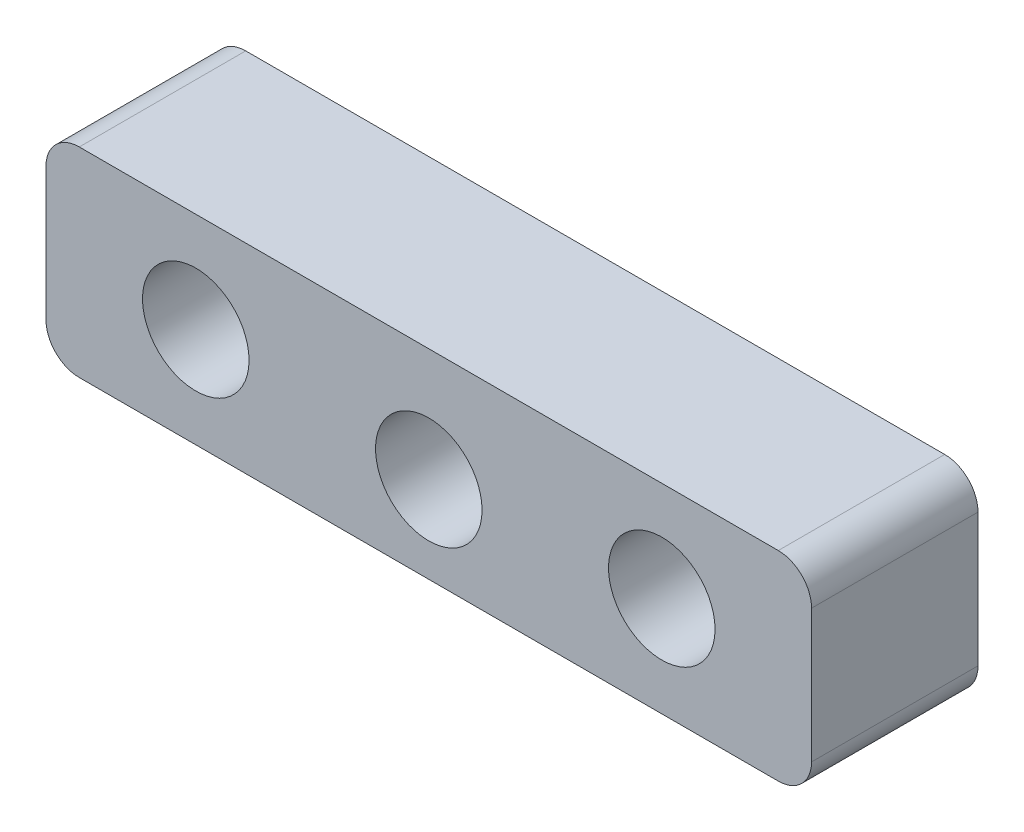
ISO-10303-21;
HEADER;
FILE_DESCRIPTION(('STEP AP214'),'2;1');
FILE_NAME('part.step','',(''),(''),'','','');
FILE_SCHEMA(('AUTOMOTIVE_DESIGN { 1 0 10303 214 1 1 1 1 }'));
ENDSEC;
DATA;
#1=APPLICATION_CONTEXT('core data for automotive mechanical design processes');
#2=APPLICATION_PROTOCOL_DEFINITION('international standard','automotive_design',2000,#1);
#3=PRODUCT_CONTEXT('',#1,'mechanical');
#4=PRODUCT('Part','Part','',(#3));
#5=PRODUCT_RELATED_PRODUCT_CATEGORY('part','',(#4));
#6=PRODUCT_DEFINITION_FORMATION('','',#4);
#7=PRODUCT_DEFINITION_CONTEXT('part definition',#1,'design');
#8=PRODUCT_DEFINITION('design','',#6,#7);
#9=PRODUCT_DEFINITION_SHAPE('','',#8);
#10=(LENGTH_UNIT() NAMED_UNIT(*) SI_UNIT(.MILLI.,.METRE.));
#11=(NAMED_UNIT(*) PLANE_ANGLE_UNIT() SI_UNIT($,.RADIAN.));
#12=(NAMED_UNIT(*) SI_UNIT($,.STERADIAN.) SOLID_ANGLE_UNIT());
#13=UNCERTAINTY_MEASURE_WITH_UNIT(LENGTH_MEASURE(1.E-05),#10,'distance_accuracy_value','');
#14=(GEOMETRIC_REPRESENTATION_CONTEXT(3) GLOBAL_UNCERTAINTY_ASSIGNED_CONTEXT((#13)) GLOBAL_UNIT_ASSIGNED_CONTEXT((#10,
#11,#12)) REPRESENTATION_CONTEXT('',''));
#15=CARTESIAN_POINT('',(0.,0.,0.));
#16=DIRECTION('',(0.,0.,1.));
#17=DIRECTION('',(1.,0.,0.));
#18=AXIS2_PLACEMENT_3D('',#15,#16,#17);
#19=CARTESIAN_POINT('',(11.5,3.,5.));
#20=DIRECTION('',(-1.,0.,0.));
#21=DIRECTION('',(0.,0.,1.));
#22=AXIS2_PLACEMENT_3D('',#19,#20,#21);
#23=PLANE('',#22);
#24=DIRECTION('',(0.,1.,0.));
#25=VECTOR('',#24,1.);
#26=CARTESIAN_POINT('',(11.5,3.,5.));
#27=LINE('',#26,#25);
#28=CARTESIAN_POINT('',(11.5,-2.,5.));
#29=VERTEX_POINT('',#28);
#30=CARTESIAN_POINT('',(11.5,2.,5.));
#31=VERTEX_POINT('',#30);
#32=EDGE_CURVE('E132',#29,#31,#27,.T.);
#33=ORIENTED_EDGE('',*,*,#32,.F.);
#34=DIRECTION('',(0.,0.,-1.));
#35=VECTOR('',#34,1.);
#36=CARTESIAN_POINT('',(11.5,-2.,5.));
#37=LINE('',#36,#35);
#38=CARTESIAN_POINT('',(11.5,-2.,0.));
#39=VERTEX_POINT('',#38);
#40=EDGE_CURVE('E116',#29,#39,#37,.T.);
#41=ORIENTED_EDGE('',*,*,#40,.T.);
#42=DIRECTION('',(0.,1.,0.));
#43=VECTOR('',#42,1.);
#44=CARTESIAN_POINT('',(11.5,3.,0.));
#45=LINE('',#44,#43);
#46=CARTESIAN_POINT('',(11.5,2.,0.));
#47=VERTEX_POINT('',#46);
#48=EDGE_CURVE('E129',#39,#47,#45,.T.);
#49=ORIENTED_EDGE('',*,*,#48,.T.);
#50=DIRECTION('',(0.,0.,-1.));
#51=VECTOR('',#50,1.);
#52=CARTESIAN_POINT('',(11.5,2.,5.));
#53=LINE('',#52,#51);
#54=EDGE_CURVE('E135',#47,#31,#53,.F.);
#55=ORIENTED_EDGE('',*,*,#54,.T.);
#56=EDGE_LOOP('',(#33,#41,#49,#55));
#57=FACE_BOUND('',#56,.T.);
#58=ADVANCED_FACE('F45',(#57),#23,.F.);
#59=CARTESIAN_POINT('',(-11.5,3.,5.));
#60=DIRECTION('',(0.,-1.,0.));
#61=DIRECTION('',(0.,0.,-1.));
#62=AXIS2_PLACEMENT_3D('',#59,#60,#61);
#63=PLANE('',#62);
#64=DIRECTION('',(-1.,0.,0.));
#65=VECTOR('',#64,1.);
#66=CARTESIAN_POINT('',(-11.5,3.,5.));
#67=LINE('',#66,#65);
#68=CARTESIAN_POINT('',(10.5,3.,5.));
#69=VERTEX_POINT('',#68);
#70=CARTESIAN_POINT('',(-10.5,3.,5.));
#71=VERTEX_POINT('',#70);
#72=EDGE_CURVE('E197',#69,#71,#67,.T.);
#73=ORIENTED_EDGE('',*,*,#72,.F.);
#74=DIRECTION('',(0.,0.,-1.));
#75=VECTOR('',#74,1.);
#76=CARTESIAN_POINT('',(10.5,3.,5.));
#77=LINE('',#76,#75);
#78=CARTESIAN_POINT('',(10.5,3.,0.));
#79=VERTEX_POINT('',#78);
#80=EDGE_CURVE('E188',#69,#79,#77,.T.);
#81=ORIENTED_EDGE('',*,*,#80,.T.);
#82=DIRECTION('',(-1.,0.,0.));
#83=VECTOR('',#82,1.);
#84=CARTESIAN_POINT('',(-11.5,3.,0.));
#85=LINE('',#84,#83);
#86=CARTESIAN_POINT('',(-10.5,3.,0.));
#87=VERTEX_POINT('',#86);
#88=EDGE_CURVE('E140',#79,#87,#85,.T.);
#89=ORIENTED_EDGE('',*,*,#88,.T.);
#90=DIRECTION('',(0.,0.,-1.));
#91=VECTOR('',#90,1.);
#92=CARTESIAN_POINT('',(-10.5,3.,5.));
#93=LINE('',#92,#91);
#94=EDGE_CURVE('E185',#87,#71,#93,.F.);
#95=ORIENTED_EDGE('',*,*,#94,.T.);
#96=EDGE_LOOP('',(#73,#81,#89,#95));
#97=FACE_BOUND('',#96,.T.);
#98=ADVANCED_FACE('F246',(#97),#63,.F.);
#99=CARTESIAN_POINT('',(-11.5,3.,5.));
#100=DIRECTION('',(1.,0.,0.));
#101=DIRECTION('',(0.,0.,-1.));
#102=AXIS2_PLACEMENT_3D('',#99,#100,#101);
#103=PLANE('',#102);
#104=DIRECTION('',(0.,-1.,0.));
#105=VECTOR('',#104,1.);
#106=CARTESIAN_POINT('',(-11.5,3.,5.));
#107=LINE('',#106,#105);
#108=CARTESIAN_POINT('',(-11.5,2.,5.));
#109=VERTEX_POINT('',#108);
#110=CARTESIAN_POINT('',(-11.5,-2.,5.));
#111=VERTEX_POINT('',#110);
#112=EDGE_CURVE('E195',#109,#111,#107,.T.);
#113=ORIENTED_EDGE('',*,*,#112,.F.);
#114=DIRECTION('',(0.,0.,-1.));
#115=VECTOR('',#114,1.);
#116=CARTESIAN_POINT('',(-11.5,2.,5.));
#117=LINE('',#116,#115);
#118=CARTESIAN_POINT('',(-11.5,2.,0.));
#119=VERTEX_POINT('',#118);
#120=EDGE_CURVE('E11',#109,#119,#117,.T.);
#121=ORIENTED_EDGE('',*,*,#120,.T.);
#122=DIRECTION('',(0.,-1.,0.));
#123=VECTOR('',#122,1.);
#124=CARTESIAN_POINT('',(-11.5,3.,0.));
#125=LINE('',#124,#123);
#126=CARTESIAN_POINT('',(-11.5,-2.,0.));
#127=VERTEX_POINT('',#126);
#128=EDGE_CURVE('E146',#119,#127,#125,.T.);
#129=ORIENTED_EDGE('',*,*,#128,.T.);
#130=DIRECTION('',(0.,0.,-1.));
#131=VECTOR('',#130,1.);
#132=CARTESIAN_POINT('',(-11.5,-2.,5.));
#133=LINE('',#132,#131);
#134=EDGE_CURVE('E54',#127,#111,#133,.F.);
#135=ORIENTED_EDGE('',*,*,#134,.T.);
#136=EDGE_LOOP('',(#113,#121,#129,#135));
#137=FACE_BOUND('',#136,.T.);
#138=ADVANCED_FACE('F239',(#137),#103,.F.);
#139=CARTESIAN_POINT('',(-11.5,-3.,5.));
#140=DIRECTION('',(0.,1.,0.));
#141=DIRECTION('',(-1.,0.,0.));
#142=AXIS2_PLACEMENT_3D('',#139,#140,#141);
#143=PLANE('',#142);
#144=DIRECTION('',(1.,0.,0.));
#145=VECTOR('',#144,1.);
#146=CARTESIAN_POINT('',(-11.5,-3.,0.));
#147=LINE('',#146,#145);
#148=CARTESIAN_POINT('',(-10.5,-3.,0.));
#149=VERTEX_POINT('',#148);
#150=CARTESIAN_POINT('',(10.5,-3.,0.));
#151=VERTEX_POINT('',#150);
#152=EDGE_CURVE('E157',#149,#151,#147,.T.);
#153=ORIENTED_EDGE('',*,*,#152,.T.);
#154=DIRECTION('',(0.,0.,-1.));
#155=VECTOR('',#154,1.);
#156=CARTESIAN_POINT('',(10.5,-3.,5.));
#157=LINE('',#156,#155);
#158=CARTESIAN_POINT('',(10.5,-3.,5.));
#159=VERTEX_POINT('',#158);
#160=EDGE_CURVE('E117',#151,#159,#157,.F.);
#161=ORIENTED_EDGE('',*,*,#160,.T.);
#162=DIRECTION('',(1.,0.,0.));
#163=VECTOR('',#162,1.);
#164=CARTESIAN_POINT('',(-11.5,-3.,5.));
#165=LINE('',#164,#163);
#166=CARTESIAN_POINT('',(-10.5,-3.,5.));
#167=VERTEX_POINT('',#166);
#168=EDGE_CURVE('E152',#167,#159,#165,.T.);
#169=ORIENTED_EDGE('',*,*,#168,.F.);
#170=DIRECTION('',(0.,0.,-1.));
#171=VECTOR('',#170,1.);
#172=CARTESIAN_POINT('',(-10.5,-3.,5.));
#173=LINE('',#172,#171);
#174=EDGE_CURVE('E123',#167,#149,#173,.T.);
#175=ORIENTED_EDGE('',*,*,#174,.T.);
#176=EDGE_LOOP('',(#153,#161,#169,#175));
#177=FACE_BOUND('',#176,.T.);
#178=ADVANCED_FACE('F228',(#177),#143,.F.);
#179=CARTESIAN_POINT('',(0.,0.,5.));
#180=DIRECTION('',(0.,0.,1.));
#181=DIRECTION('',(1.,0.,0.));
#182=AXIS2_PLACEMENT_3D('',#179,#180,#181);
#183=PLANE('',#182);
#184=CARTESIAN_POINT('',(-7.,0.,5.));
#185=DIRECTION('',(0.,0.,1.));
#186=DIRECTION('',(1.,0.,0.));
#187=AXIS2_PLACEMENT_3D('',#184,#185,#186);
#188=CIRCLE('',#187,1.6);
#189=CARTESIAN_POINT('',(-5.4,0.,5.));
#190=VERTEX_POINT('',#189);
#191=EDGE_CURVE('E149',#190,#190,#188,.T.);
#192=ORIENTED_EDGE('',*,*,#191,.F.);
#193=EDGE_LOOP('',(#192));
#194=FACE_BOUND('',#193,.T.);
#195=CARTESIAN_POINT('',(7.,0.,5.));
#196=DIRECTION('',(0.,0.,1.));
#197=DIRECTION('',(1.,0.,0.));
#198=AXIS2_PLACEMENT_3D('',#195,#196,#197);
#199=CIRCLE('',#198,1.6);
#200=CARTESIAN_POINT('',(8.6,0.,5.));
#201=VERTEX_POINT('',#200);
#202=EDGE_CURVE('E215',#201,#201,#199,.T.);
#203=ORIENTED_EDGE('',*,*,#202,.F.);
#204=EDGE_LOOP('',(#203));
#205=FACE_BOUND('',#204,.T.);
#206=CARTESIAN_POINT('',(0.,-0.4,5.));
#207=DIRECTION('',(0.,0.,1.));
#208=DIRECTION('',(1.,0.,0.));
#209=AXIS2_PLACEMENT_3D('',#206,#207,#208);
#210=CIRCLE('',#209,1.6);
#211=CARTESIAN_POINT('',(1.6,-0.4,5.));
#212=VERTEX_POINT('',#211);
#213=EDGE_CURVE('E207',#212,#212,#210,.T.);
#214=ORIENTED_EDGE('',*,*,#213,.F.);
#215=EDGE_LOOP('',(#214));
#216=FACE_BOUND('',#215,.T.);
#217=ORIENTED_EDGE('',*,*,#168,.T.);
#218=CARTESIAN_POINT('',(10.5,-2.,5.));
#219=DIRECTION('',(0.,0.,1.));
#220=DIRECTION('',(1.,0.,0.));
#221=AXIS2_PLACEMENT_3D('',#218,#219,#220);
#222=CIRCLE('',#221,1.);
#223=EDGE_CURVE('E182',#159,#29,#222,.T.);
#224=ORIENTED_EDGE('',*,*,#223,.T.);
#225=ORIENTED_EDGE('',*,*,#32,.T.);
#226=CARTESIAN_POINT('',(10.5,2.,5.));
#227=DIRECTION('',(0.,0.,1.));
#228=DIRECTION('',(1.,0.,0.));
#229=AXIS2_PLACEMENT_3D('',#226,#227,#228);
#230=CIRCLE('',#229,1.);
#231=EDGE_CURVE('E179',#31,#69,#230,.T.);
#232=ORIENTED_EDGE('',*,*,#231,.T.);
#233=ORIENTED_EDGE('',*,*,#72,.T.);
#234=CARTESIAN_POINT('',(-10.5,2.,5.));
#235=DIRECTION('',(0.,0.,1.));
#236=DIRECTION('',(1.,0.,0.));
#237=AXIS2_PLACEMENT_3D('',#234,#235,#236);
#238=CIRCLE('',#237,1.);
#239=EDGE_CURVE('E67',#71,#109,#238,.T.);
#240=ORIENTED_EDGE('',*,*,#239,.T.);
#241=ORIENTED_EDGE('',*,*,#112,.T.);
#242=CARTESIAN_POINT('',(-10.5,-2.,5.));
#243=DIRECTION('',(0.,0.,1.));
#244=DIRECTION('',(1.,0.,0.));
#245=AXIS2_PLACEMENT_3D('',#242,#243,#244);
#246=CIRCLE('',#245,1.);
#247=EDGE_CURVE('E174',#111,#167,#246,.T.);
#248=ORIENTED_EDGE('',*,*,#247,.T.);
#249=EDGE_LOOP('',(#217,#224,#225,#232,#233,#240,#241,#248));
#250=FACE_BOUND('',#249,.T.);
#251=ADVANCED_FACE('F225',(#194,#205,#216,#250),#183,.T.);
#252=CARTESIAN_POINT('',(0.,0.,0.));
#253=DIRECTION('',(0.,0.,1.));
#254=DIRECTION('',(1.,0.,0.));
#255=AXIS2_PLACEMENT_3D('',#252,#253,#254);
#256=PLANE('',#255);
#257=CARTESIAN_POINT('',(-7.,0.,0.));
#258=DIRECTION('',(0.,0.,1.));
#259=DIRECTION('',(1.,0.,0.));
#260=AXIS2_PLACEMENT_3D('',#257,#258,#259);
#261=CIRCLE('',#260,1.6);
#262=CARTESIAN_POINT('',(-5.4,0.,0.));
#263=VERTEX_POINT('',#262);
#264=EDGE_CURVE('E141',#263,#263,#261,.T.);
#265=ORIENTED_EDGE('',*,*,#264,.T.);
#266=EDGE_LOOP('',(#265));
#267=FACE_BOUND('',#266,.T.);
#268=CARTESIAN_POINT('',(7.,0.,0.));
#269=DIRECTION('',(0.,0.,1.));
#270=DIRECTION('',(1.,0.,0.));
#271=AXIS2_PLACEMENT_3D('',#268,#269,#270);
#272=CIRCLE('',#271,1.6);
#273=CARTESIAN_POINT('',(8.6,0.,0.));
#274=VERTEX_POINT('',#273);
#275=EDGE_CURVE('E211',#274,#274,#272,.T.);
#276=ORIENTED_EDGE('',*,*,#275,.T.);
#277=EDGE_LOOP('',(#276));
#278=FACE_BOUND('',#277,.T.);
#279=CARTESIAN_POINT('',(0.,-0.4,0.));
#280=DIRECTION('',(0.,0.,1.));
#281=DIRECTION('',(1.,0.,0.));
#282=AXIS2_PLACEMENT_3D('',#279,#280,#281);
#283=CIRCLE('',#282,1.6);
#284=CARTESIAN_POINT('',(1.6,-0.4,0.));
#285=VERTEX_POINT('',#284);
#286=EDGE_CURVE('E203',#285,#285,#283,.T.);
#287=ORIENTED_EDGE('',*,*,#286,.T.);
#288=EDGE_LOOP('',(#287));
#289=FACE_BOUND('',#288,.T.);
#290=ORIENTED_EDGE('',*,*,#48,.F.);
#291=CARTESIAN_POINT('',(10.5,-2.,0.));
#292=DIRECTION('',(0.,0.,1.));
#293=DIRECTION('',(1.,0.,0.));
#294=AXIS2_PLACEMENT_3D('',#291,#292,#293);
#295=CIRCLE('',#294,1.);
#296=EDGE_CURVE('E112',#39,#151,#295,.F.);
#297=ORIENTED_EDGE('',*,*,#296,.T.);
#298=ORIENTED_EDGE('',*,*,#152,.F.);
#299=CARTESIAN_POINT('',(-10.5,-2.,0.));
#300=DIRECTION('',(0.,0.,1.));
#301=DIRECTION('',(1.,0.,0.));
#302=AXIS2_PLACEMENT_3D('',#299,#300,#301);
#303=CIRCLE('',#302,1.);
#304=EDGE_CURVE('E134',#149,#127,#303,.F.);
#305=ORIENTED_EDGE('',*,*,#304,.T.);
#306=ORIENTED_EDGE('',*,*,#128,.F.);
#307=CARTESIAN_POINT('',(-10.5,2.,0.));
#308=DIRECTION('',(0.,0.,1.));
#309=DIRECTION('',(1.,0.,0.));
#310=AXIS2_PLACEMENT_3D('',#307,#308,#309);
#311=CIRCLE('',#310,1.);
#312=EDGE_CURVE('E164',#119,#87,#311,.F.);
#313=ORIENTED_EDGE('',*,*,#312,.T.);
#314=ORIENTED_EDGE('',*,*,#88,.F.);
#315=CARTESIAN_POINT('',(10.5,2.,0.));
#316=DIRECTION('',(0.,0.,1.));
#317=DIRECTION('',(1.,0.,0.));
#318=AXIS2_PLACEMENT_3D('',#315,#316,#317);
#319=CIRCLE('',#318,1.);
#320=EDGE_CURVE('E124',#79,#47,#319,.F.);
#321=ORIENTED_EDGE('',*,*,#320,.T.);
#322=EDGE_LOOP('',(#290,#297,#298,#305,#306,#313,#314,#321));
#323=FACE_BOUND('',#322,.T.);
#324=ADVANCED_FACE('F137',(#267,#278,#289,#323),#256,.F.);
#325=CARTESIAN_POINT('',(0.,-0.4,0.));
#326=DIRECTION('',(0.,0.,1.));
#327=DIRECTION('',(1.,0.,0.));
#328=AXIS2_PLACEMENT_3D('',#325,#326,#327);
#329=CYLINDRICAL_SURFACE('',#328,1.6);
#330=ORIENTED_EDGE('',*,*,#286,.F.);
#331=EDGE_LOOP('',(#330));
#332=FACE_BOUND('',#331,.T.);
#333=ORIENTED_EDGE('',*,*,#213,.T.);
#334=EDGE_LOOP('',(#333));
#335=FACE_BOUND('',#334,.T.);
#336=ADVANCED_FACE('F270',(#332,#335),#329,.F.);
#337=CARTESIAN_POINT('',(7.,0.,0.));
#338=DIRECTION('',(0.,0.,1.));
#339=DIRECTION('',(1.,0.,0.));
#340=AXIS2_PLACEMENT_3D('',#337,#338,#339);
#341=CYLINDRICAL_SURFACE('',#340,1.6);
#342=ORIENTED_EDGE('',*,*,#275,.F.);
#343=EDGE_LOOP('',(#342));
#344=FACE_BOUND('',#343,.T.);
#345=ORIENTED_EDGE('',*,*,#202,.T.);
#346=EDGE_LOOP('',(#345));
#347=FACE_BOUND('',#346,.T.);
#348=ADVANCED_FACE('F275',(#344,#347),#341,.F.);
#349=CARTESIAN_POINT('',(-7.,0.,0.));
#350=DIRECTION('',(0.,0.,1.));
#351=DIRECTION('',(1.,0.,0.));
#352=AXIS2_PLACEMENT_3D('',#349,#350,#351);
#353=CYLINDRICAL_SURFACE('',#352,1.6);
#354=ORIENTED_EDGE('',*,*,#264,.F.);
#355=EDGE_LOOP('',(#354));
#356=FACE_BOUND('',#355,.T.);
#357=ORIENTED_EDGE('',*,*,#191,.T.);
#358=EDGE_LOOP('',(#357));
#359=FACE_BOUND('',#358,.T.);
#360=ADVANCED_FACE('F223',(#356,#359),#353,.F.);
#361=CARTESIAN_POINT('',(10.5,-2.,5.));
#362=DIRECTION('',(0.,0.,-1.));
#363=DIRECTION('',(-1.,0.,0.));
#364=AXIS2_PLACEMENT_3D('',#361,#362,#363);
#365=CYLINDRICAL_SURFACE('',#364,1.);
#366=ORIENTED_EDGE('',*,*,#223,.F.);
#367=ORIENTED_EDGE('',*,*,#160,.F.);
#368=ORIENTED_EDGE('',*,*,#296,.F.);
#369=ORIENTED_EDGE('',*,*,#40,.F.);
#370=EDGE_LOOP('',(#366,#367,#368,#369));
#371=FACE_BOUND('',#370,.T.);
#372=ADVANCED_FACE('F115',(#371),#365,.T.);
#373=CARTESIAN_POINT('',(10.5,2.,5.));
#374=DIRECTION('',(0.,0.,-1.));
#375=DIRECTION('',(-1.,0.,0.));
#376=AXIS2_PLACEMENT_3D('',#373,#374,#375);
#377=CYLINDRICAL_SURFACE('',#376,1.);
#378=ORIENTED_EDGE('',*,*,#231,.F.);
#379=ORIENTED_EDGE('',*,*,#54,.F.);
#380=ORIENTED_EDGE('',*,*,#320,.F.);
#381=ORIENTED_EDGE('',*,*,#80,.F.);
#382=EDGE_LOOP('',(#378,#379,#380,#381));
#383=FACE_BOUND('',#382,.T.);
#384=ADVANCED_FACE('F249',(#383),#377,.T.);
#385=CARTESIAN_POINT('',(-10.5,2.,5.));
#386=DIRECTION('',(0.,0.,-1.));
#387=DIRECTION('',(-1.,0.,0.));
#388=AXIS2_PLACEMENT_3D('',#385,#386,#387);
#389=CYLINDRICAL_SURFACE('',#388,1.);
#390=ORIENTED_EDGE('',*,*,#239,.F.);
#391=ORIENTED_EDGE('',*,*,#94,.F.);
#392=ORIENTED_EDGE('',*,*,#312,.F.);
#393=ORIENTED_EDGE('',*,*,#120,.F.);
#394=EDGE_LOOP('',(#390,#391,#392,#393));
#395=FACE_BOUND('',#394,.T.);
#396=ADVANCED_FACE('F242',(#395),#389,.T.);
#397=CARTESIAN_POINT('',(-10.5,-2.,5.));
#398=DIRECTION('',(0.,0.,-1.));
#399=DIRECTION('',(-1.,0.,0.));
#400=AXIS2_PLACEMENT_3D('',#397,#398,#399);
#401=CYLINDRICAL_SURFACE('',#400,1.);
#402=ORIENTED_EDGE('',*,*,#247,.F.);
#403=ORIENTED_EDGE('',*,*,#134,.F.);
#404=ORIENTED_EDGE('',*,*,#304,.F.);
#405=ORIENTED_EDGE('',*,*,#174,.F.);
#406=EDGE_LOOP('',(#402,#403,#404,#405));
#407=FACE_BOUND('',#406,.T.);
#408=ADVANCED_FACE('F47',(#407),#401,.T.);
#409=CLOSED_SHELL('',(#58,#98,#138,#178,#251,#324,#336,#348,#360,#372,#384,#396,#408));
#410=MANIFOLD_SOLID_BREP('B2',#409);
#411=ADVANCED_BREP_SHAPE_REPRESENTATION('',(#18,#410),#14);
#412=SHAPE_DEFINITION_REPRESENTATION(#9,#411);
ENDSEC;
END-ISO-10303-21;
